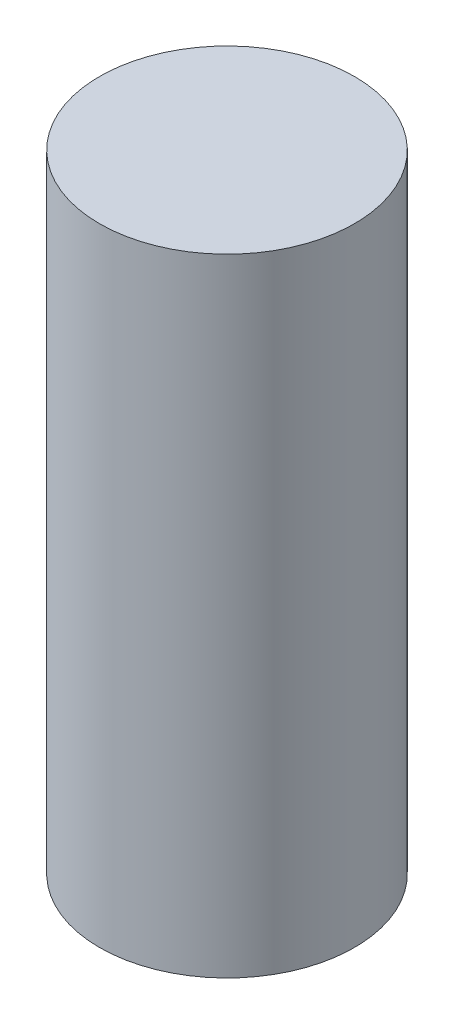
ISO-10303-21;
HEADER;
FILE_DESCRIPTION(('STEP AP214'),'2;1');
FILE_NAME('part.step','',(''),(''),'','','');
FILE_SCHEMA(('AUTOMOTIVE_DESIGN { 1 0 10303 214 1 1 1 1 }'));
ENDSEC;
DATA;
#1=APPLICATION_CONTEXT('core data for automotive mechanical design processes');
#2=APPLICATION_PROTOCOL_DEFINITION('international standard','automotive_design',2000,#1);
#3=PRODUCT_CONTEXT('',#1,'mechanical');
#4=PRODUCT('Part','Part','',(#3));
#5=PRODUCT_RELATED_PRODUCT_CATEGORY('part','',(#4));
#6=PRODUCT_DEFINITION_FORMATION('','',#4);
#7=PRODUCT_DEFINITION_CONTEXT('part definition',#1,'design');
#8=PRODUCT_DEFINITION('design','',#6,#7);
#9=PRODUCT_DEFINITION_SHAPE('','',#8);
#10=(LENGTH_UNIT() NAMED_UNIT(*) SI_UNIT(.MILLI.,.METRE.));
#11=(NAMED_UNIT(*) PLANE_ANGLE_UNIT() SI_UNIT($,.RADIAN.));
#12=(NAMED_UNIT(*) SI_UNIT($,.STERADIAN.) SOLID_ANGLE_UNIT());
#13=UNCERTAINTY_MEASURE_WITH_UNIT(LENGTH_MEASURE(1.E-05),#10,'distance_accuracy_value','');
#14=(GEOMETRIC_REPRESENTATION_CONTEXT(3) GLOBAL_UNCERTAINTY_ASSIGNED_CONTEXT((#13)) GLOBAL_UNIT_ASSIGNED_CONTEXT((#10,
#11,#12)) REPRESENTATION_CONTEXT('',''));
#15=CARTESIAN_POINT('',(0.,0.,0.));
#16=DIRECTION('',(0.,0.,1.));
#17=DIRECTION('',(1.,0.,0.));
#18=AXIS2_PLACEMENT_3D('',#15,#16,#17);
#19=CARTESIAN_POINT('',(0.,-23.4122,0.));
#20=DIRECTION('',(0.,-1.,0.));
#21=DIRECTION('',(0.,0.,-1.));
#22=AXIS2_PLACEMENT_3D('',#19,#20,#21);
#23=PLANE('',#22);
#24=CARTESIAN_POINT('',(0.,-23.4122,0.));
#25=DIRECTION('',(0.,-1.,0.));
#26=DIRECTION('',(0.,0.,-1.));
#27=AXIS2_PLACEMENT_3D('',#24,#25,#26);
#28=CIRCLE('',#27,4.7625);
#29=CARTESIAN_POINT('',(0.,-23.4122,-4.7625));
#30=VERTEX_POINT('',#29);
#31=EDGE_CURVE('E10',#30,#30,#28,.F.);
#32=ORIENTED_EDGE('',*,*,#31,.F.);
#33=EDGE_LOOP('',(#32));
#34=FACE_BOUND('',#33,.T.);
#35=ADVANCED_FACE('F33',(#34),#23,.T.);
#36=CARTESIAN_POINT('',(0.,0.,0.));
#37=DIRECTION('',(0.,1.,0.));
#38=DIRECTION('',(0.,0.,1.));
#39=AXIS2_PLACEMENT_3D('',#36,#37,#38);
#40=PLANE('',#39);
#41=CARTESIAN_POINT('',(0.,0.,0.));
#42=DIRECTION('',(0.,1.,0.));
#43=DIRECTION('',(0.,0.,1.));
#44=AXIS2_PLACEMENT_3D('',#41,#42,#43);
#45=CIRCLE('',#44,4.7625);
#46=CARTESIAN_POINT('',(0.,0.,4.7625));
#47=VERTEX_POINT('',#46);
#48=EDGE_CURVE('E39',#47,#47,#45,.T.);
#49=ORIENTED_EDGE('',*,*,#48,.T.);
#50=EDGE_LOOP('',(#49));
#51=FACE_BOUND('',#50,.T.);
#52=ADVANCED_FACE('F45',(#51),#40,.T.);
#53=CARTESIAN_POINT('',(0.,-36.8825841816037,0.));
#54=DIRECTION('',(0.,1.,0.));
#55=DIRECTION('',(0.,0.,1.));
#56=AXIS2_PLACEMENT_3D('',#53,#54,#55);
#57=CYLINDRICAL_SURFACE('',#56,4.7625);
#58=ORIENTED_EDGE('',*,*,#48,.F.);
#59=EDGE_LOOP('',(#58));
#60=FACE_BOUND('',#59,.T.);
#61=ORIENTED_EDGE('',*,*,#31,.T.);
#62=EDGE_LOOP('',(#61));
#63=FACE_BOUND('',#62,.T.);
#64=ADVANCED_FACE('F47',(#60,#63),#57,.T.);
#65=CLOSED_SHELL('',(#35,#52,#64));
#66=MANIFOLD_SOLID_BREP('B2',#65);
#67=ADVANCED_BREP_SHAPE_REPRESENTATION('',(#18,#66),#14);
#68=SHAPE_DEFINITION_REPRESENTATION(#9,#67);
ENDSEC;
END-ISO-10303-21;
